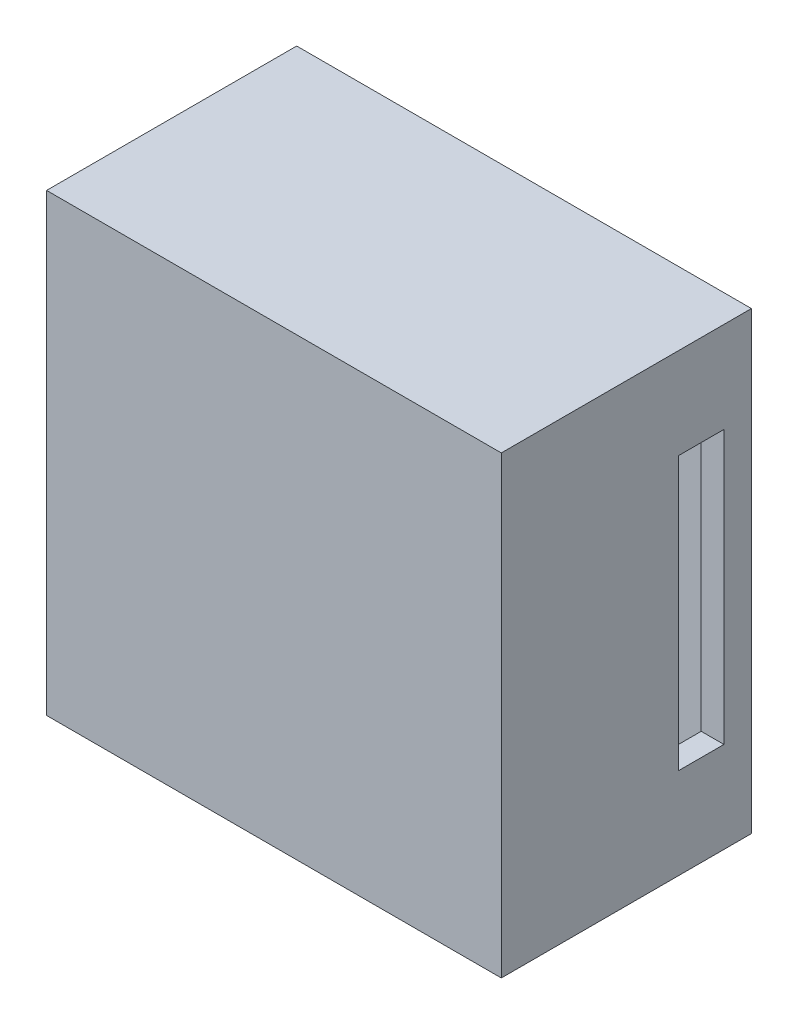
ISO-10303-21;
HEADER;
FILE_DESCRIPTION(('STEP AP214'),'2;1');
FILE_NAME('part.step','',(''),(''),'','','');
FILE_SCHEMA(('AUTOMOTIVE_DESIGN { 1 0 10303 214 1 1 1 1 }'));
ENDSEC;
DATA;
#1=APPLICATION_CONTEXT('core data for automotive mechanical design processes');
#2=APPLICATION_PROTOCOL_DEFINITION('international standard','automotive_design',2000,#1);
#3=PRODUCT_CONTEXT('',#1,'mechanical');
#4=PRODUCT('Part','Part','',(#3));
#5=PRODUCT_RELATED_PRODUCT_CATEGORY('part','',(#4));
#6=PRODUCT_DEFINITION_FORMATION('','',#4);
#7=PRODUCT_DEFINITION_CONTEXT('part definition',#1,'design');
#8=PRODUCT_DEFINITION('design','',#6,#7);
#9=PRODUCT_DEFINITION_SHAPE('','',#8);
#10=(LENGTH_UNIT() NAMED_UNIT(*) SI_UNIT(.MILLI.,.METRE.));
#11=(NAMED_UNIT(*) PLANE_ANGLE_UNIT() SI_UNIT($,.RADIAN.));
#12=(NAMED_UNIT(*) SI_UNIT($,.STERADIAN.) SOLID_ANGLE_UNIT());
#13=UNCERTAINTY_MEASURE_WITH_UNIT(LENGTH_MEASURE(1.E-05),#10,'distance_accuracy_value','');
#14=(GEOMETRIC_REPRESENTATION_CONTEXT(3) GLOBAL_UNCERTAINTY_ASSIGNED_CONTEXT((#13)) GLOBAL_UNIT_ASSIGNED_CONTEXT((#10,
#11,#12)) REPRESENTATION_CONTEXT('',''));
#15=CARTESIAN_POINT('',(0.,0.,0.));
#16=DIRECTION('',(0.,0.,1.));
#17=DIRECTION('',(1.,0.,0.));
#18=AXIS2_PLACEMENT_3D('',#15,#16,#17);
#19=CARTESIAN_POINT('',(50.,-50.,50.));
#20=DIRECTION('',(-1.,0.,0.));
#21=DIRECTION('',(0.,0.,1.));
#22=AXIS2_PLACEMENT_3D('',#19,#20,#21);
#23=PLANE('',#22);
#24=DIRECTION('',(0.,0.,-1.));
#25=VECTOR('',#24,1.);
#26=CARTESIAN_POINT('',(50.,-30.,16.0409771403343));
#27=LINE('',#26,#25);
#28=CARTESIAN_POINT('',(50.,-30.,16.0409771403343));
#29=VERTEX_POINT('',#28);
#30=CARTESIAN_POINT('',(50.,-30.,6.0409771403343));
#31=VERTEX_POINT('',#30);
#32=EDGE_CURVE('E156',#29,#31,#27,.T.);
#33=ORIENTED_EDGE('',*,*,#32,.F.);
#34=DIRECTION('',(0.,-1.,0.));
#35=VECTOR('',#34,1.);
#36=CARTESIAN_POINT('',(50.,30.,16.0409771403343));
#37=LINE('',#36,#35);
#38=CARTESIAN_POINT('',(50.,30.,16.0409771403343));
#39=VERTEX_POINT('',#38);
#40=EDGE_CURVE('E51',#39,#29,#37,.T.);
#41=ORIENTED_EDGE('',*,*,#40,.F.);
#42=DIRECTION('',(0.,0.,1.));
#43=VECTOR('',#42,1.);
#44=CARTESIAN_POINT('',(50.,30.,16.0409771403343));
#45=LINE('',#44,#43);
#46=CARTESIAN_POINT('',(50.,30.,6.04097714033431));
#47=VERTEX_POINT('',#46);
#48=EDGE_CURVE('E161',#47,#39,#45,.T.);
#49=ORIENTED_EDGE('',*,*,#48,.F.);
#50=DIRECTION('',(0.,1.,0.));
#51=VECTOR('',#50,1.);
#52=CARTESIAN_POINT('',(50.,30.,6.04097714033431));
#53=LINE('',#52,#51);
#54=EDGE_CURVE('E158',#31,#47,#53,.T.);
#55=ORIENTED_EDGE('',*,*,#54,.F.);
#56=EDGE_LOOP('',(#33,#41,#49,#55));
#57=FACE_BOUND('',#56,.T.);
#58=DIRECTION('',(0.,1.,0.));
#59=VECTOR('',#58,1.);
#60=CARTESIAN_POINT('',(50.,-50.,0.));
#61=LINE('',#60,#59);
#62=CARTESIAN_POINT('',(50.,-50.,0.));
#63=VERTEX_POINT('',#62);
#64=CARTESIAN_POINT('',(50.,50.,0.));
#65=VERTEX_POINT('',#64);
#66=EDGE_CURVE('E178',#63,#65,#61,.T.);
#67=ORIENTED_EDGE('',*,*,#66,.T.);
#68=DIRECTION('',(0.,0.,-1.));
#69=VECTOR('',#68,1.);
#70=CARTESIAN_POINT('',(50.,50.,50.));
#71=LINE('',#70,#69);
#72=CARTESIAN_POINT('',(50.,50.,55.));
#73=VERTEX_POINT('',#72);
#74=EDGE_CURVE('E214',#73,#65,#71,.T.);
#75=ORIENTED_EDGE('',*,*,#74,.F.);
#76=DIRECTION('',(0.,1.,0.));
#77=VECTOR('',#76,1.);
#78=CARTESIAN_POINT('',(50.,50.,55.));
#79=LINE('',#78,#77);
#80=CARTESIAN_POINT('',(50.,-50.,55.));
#81=VERTEX_POINT('',#80);
#82=EDGE_CURVE('E145',#81,#73,#79,.T.);
#83=ORIENTED_EDGE('',*,*,#82,.F.);
#84=DIRECTION('',(0.,0.,-1.));
#85=VECTOR('',#84,1.);
#86=CARTESIAN_POINT('',(50.,-50.,50.));
#87=LINE('',#86,#85);
#88=EDGE_CURVE('E136',#81,#63,#87,.T.);
#89=ORIENTED_EDGE('',*,*,#88,.T.);
#90=EDGE_LOOP('',(#67,#75,#83,#89));
#91=FACE_BOUND('',#90,.T.);
#92=ADVANCED_FACE('F37',(#57,#91),#23,.F.);
#93=CARTESIAN_POINT('',(-50.,50.,50.));
#94=DIRECTION('',(0.,-1.,0.));
#95=DIRECTION('',(0.,0.,-1.));
#96=AXIS2_PLACEMENT_3D('',#93,#94,#95);
#97=PLANE('',#96);
#98=DIRECTION('',(-1.,0.,0.));
#99=VECTOR('',#98,1.);
#100=CARTESIAN_POINT('',(-50.,50.,0.));
#101=LINE('',#100,#99);
#102=CARTESIAN_POINT('',(-50.,50.,0.));
#103=VERTEX_POINT('',#102);
#104=EDGE_CURVE('E207',#65,#103,#101,.T.);
#105=ORIENTED_EDGE('',*,*,#104,.T.);
#106=DIRECTION('',(0.,0.,-1.));
#107=VECTOR('',#106,1.);
#108=CARTESIAN_POINT('',(-50.,50.,50.));
#109=LINE('',#108,#107);
#110=CARTESIAN_POINT('',(-50.,50.,55.));
#111=VERTEX_POINT('',#110);
#112=EDGE_CURVE('E135',#111,#103,#109,.T.);
#113=ORIENTED_EDGE('',*,*,#112,.F.);
#114=DIRECTION('',(-1.,0.,0.));
#115=VECTOR('',#114,1.);
#116=CARTESIAN_POINT('',(-50.,50.,55.));
#117=LINE('',#116,#115);
#118=EDGE_CURVE('E150',#73,#111,#117,.T.);
#119=ORIENTED_EDGE('',*,*,#118,.F.);
#120=ORIENTED_EDGE('',*,*,#74,.T.);
#121=EDGE_LOOP('',(#105,#113,#119,#120));
#122=FACE_BOUND('',#121,.T.);
#123=ADVANCED_FACE('F241',(#122),#97,.F.);
#124=CARTESIAN_POINT('',(-50.,-50.,50.));
#125=DIRECTION('',(1.,0.,0.));
#126=DIRECTION('',(0.,0.,-1.));
#127=AXIS2_PLACEMENT_3D('',#124,#125,#126);
#128=PLANE('',#127);
#129=DIRECTION('',(0.,-1.,0.));
#130=VECTOR('',#129,1.);
#131=CARTESIAN_POINT('',(-50.,-50.,0.));
#132=LINE('',#131,#130);
#133=CARTESIAN_POINT('',(-50.,-50.,0.));
#134=VERTEX_POINT('',#133);
#135=EDGE_CURVE('E132',#103,#134,#132,.T.);
#136=ORIENTED_EDGE('',*,*,#135,.T.);
#137=DIRECTION('',(0.,0.,-1.));
#138=VECTOR('',#137,1.);
#139=CARTESIAN_POINT('',(-50.,-50.,50.));
#140=LINE('',#139,#138);
#141=CARTESIAN_POINT('',(-50.,-50.,55.));
#142=VERTEX_POINT('',#141);
#143=EDGE_CURVE('E125',#142,#134,#140,.T.);
#144=ORIENTED_EDGE('',*,*,#143,.F.);
#145=DIRECTION('',(0.,-1.,0.));
#146=VECTOR('',#145,1.);
#147=CARTESIAN_POINT('',(-50.,50.,55.));
#148=LINE('',#147,#146);
#149=EDGE_CURVE('E130',#111,#142,#148,.T.);
#150=ORIENTED_EDGE('',*,*,#149,.F.);
#151=ORIENTED_EDGE('',*,*,#112,.T.);
#152=EDGE_LOOP('',(#136,#144,#150,#151));
#153=FACE_BOUND('',#152,.T.);
#154=ADVANCED_FACE('F127',(#153),#128,.F.);
#155=CARTESIAN_POINT('',(-50.,-50.,50.));
#156=DIRECTION('',(0.,1.,0.));
#157=DIRECTION('',(0.,0.,1.));
#158=AXIS2_PLACEMENT_3D('',#155,#156,#157);
#159=PLANE('',#158);
#160=DIRECTION('',(1.,0.,0.));
#161=VECTOR('',#160,1.);
#162=CARTESIAN_POINT('',(-50.,-50.,0.));
#163=LINE('',#162,#161);
#164=EDGE_CURVE('E210',#134,#63,#163,.T.);
#165=ORIENTED_EDGE('',*,*,#164,.T.);
#166=ORIENTED_EDGE('',*,*,#88,.F.);
#167=DIRECTION('',(1.,0.,0.));
#168=VECTOR('',#167,1.);
#169=CARTESIAN_POINT('',(-50.,-50.,55.));
#170=LINE('',#169,#168);
#171=EDGE_CURVE('E139',#142,#81,#170,.T.);
#172=ORIENTED_EDGE('',*,*,#171,.F.);
#173=ORIENTED_EDGE('',*,*,#143,.T.);
#174=EDGE_LOOP('',(#165,#166,#172,#173));
#175=FACE_BOUND('',#174,.T.);
#176=ADVANCED_FACE('F140',(#175),#159,.F.);
#177=CARTESIAN_POINT('',(0.,0.,0.));
#178=DIRECTION('',(0.,0.,-1.));
#179=DIRECTION('',(-1.,0.,0.));
#180=AXIS2_PLACEMENT_3D('',#177,#178,#179);
#181=PLANE('',#180);
#182=ORIENTED_EDGE('',*,*,#66,.F.);
#183=ORIENTED_EDGE('',*,*,#164,.F.);
#184=ORIENTED_EDGE('',*,*,#135,.F.);
#185=ORIENTED_EDGE('',*,*,#104,.F.);
#186=EDGE_LOOP('',(#182,#183,#184,#185));
#187=FACE_BOUND('',#186,.T.);
#188=ADVANCED_FACE('F244',(#187),#181,.T.);
#189=CARTESIAN_POINT('',(45.,-50.,50.));
#190=DIRECTION('',(-1.,0.,0.));
#191=DIRECTION('',(0.,0.,1.));
#192=AXIS2_PLACEMENT_3D('',#189,#190,#191);
#193=PLANE('',#192);
#194=DIRECTION('',(0.,1.,0.));
#195=VECTOR('',#194,1.);
#196=CARTESIAN_POINT('',(45.,-50.,16.0409771403343));
#197=LINE('',#196,#195);
#198=CARTESIAN_POINT('',(45.,-30.,16.0409771403343));
#199=VERTEX_POINT('',#198);
#200=CARTESIAN_POINT('',(45.,30.,16.0409771403343));
#201=VERTEX_POINT('',#200);
#202=EDGE_CURVE('E11',#199,#201,#197,.T.);
#203=ORIENTED_EDGE('',*,*,#202,.F.);
#204=DIRECTION('',(0.,0.,1.));
#205=VECTOR('',#204,1.);
#206=CARTESIAN_POINT('',(45.,-30.,50.));
#207=LINE('',#206,#205);
#208=CARTESIAN_POINT('',(45.,-30.,6.0409771403343));
#209=VERTEX_POINT('',#208);
#210=EDGE_CURVE('E217',#209,#199,#207,.T.);
#211=ORIENTED_EDGE('',*,*,#210,.F.);
#212=DIRECTION('',(0.,-1.,0.));
#213=VECTOR('',#212,1.);
#214=CARTESIAN_POINT('',(45.,-50.,6.04097714033429));
#215=LINE('',#214,#213);
#216=CARTESIAN_POINT('',(45.,30.,6.04097714033431));
#217=VERTEX_POINT('',#216);
#218=EDGE_CURVE('E219',#217,#209,#215,.T.);
#219=ORIENTED_EDGE('',*,*,#218,.F.);
#220=DIRECTION('',(0.,0.,-1.));
#221=VECTOR('',#220,1.);
#222=CARTESIAN_POINT('',(45.,30.,50.));
#223=LINE('',#222,#221);
#224=EDGE_CURVE('E44',#201,#217,#223,.T.);
#225=ORIENTED_EDGE('',*,*,#224,.F.);
#226=EDGE_LOOP('',(#203,#211,#219,#225));
#227=FACE_BOUND('',#226,.T.);
#228=DIRECTION('',(0.,1.,0.));
#229=VECTOR('',#228,1.);
#230=CARTESIAN_POINT('',(45.,0.,5.));
#231=LINE('',#230,#229);
#232=CARTESIAN_POINT('',(45.,-45.,5.));
#233=VERTEX_POINT('',#232);
#234=CARTESIAN_POINT('',(45.,45.,5.));
#235=VERTEX_POINT('',#234);
#236=EDGE_CURVE('E167',#233,#235,#231,.T.);
#237=ORIENTED_EDGE('',*,*,#236,.F.);
#238=DIRECTION('',(0.,0.,-1.));
#239=VECTOR('',#238,1.);
#240=CARTESIAN_POINT('',(45.,-45.,50.));
#241=LINE('',#240,#239);
#242=CARTESIAN_POINT('',(45.,-45.,50.));
#243=VERTEX_POINT('',#242);
#244=EDGE_CURVE('E180',#243,#233,#241,.T.);
#245=ORIENTED_EDGE('',*,*,#244,.F.);
#246=DIRECTION('',(0.,1.,0.));
#247=VECTOR('',#246,1.);
#248=CARTESIAN_POINT('',(45.,0.,50.));
#249=LINE('',#248,#247);
#250=CARTESIAN_POINT('',(45.,45.,50.));
#251=VERTEX_POINT('',#250);
#252=EDGE_CURVE('E194',#243,#251,#249,.T.);
#253=ORIENTED_EDGE('',*,*,#252,.T.);
#254=DIRECTION('',(0.,0.,-1.));
#255=VECTOR('',#254,1.);
#256=CARTESIAN_POINT('',(45.,45.,50.));
#257=LINE('',#256,#255);
#258=EDGE_CURVE('E175',#251,#235,#257,.T.);
#259=ORIENTED_EDGE('',*,*,#258,.T.);
#260=EDGE_LOOP('',(#237,#245,#253,#259));
#261=FACE_BOUND('',#260,.T.);
#262=ADVANCED_FACE('F233',(#227,#261),#193,.T.);
#263=CARTESIAN_POINT('',(-50.,45.,50.));
#264=DIRECTION('',(0.,-1.,0.));
#265=DIRECTION('',(0.,0.,-1.));
#266=AXIS2_PLACEMENT_3D('',#263,#264,#265);
#267=PLANE('',#266);
#268=DIRECTION('',(-1.,0.,0.));
#269=VECTOR('',#268,1.);
#270=CARTESIAN_POINT('',(0.,45.,5.));
#271=LINE('',#270,#269);
#272=CARTESIAN_POINT('',(-45.,45.,5.));
#273=VERTEX_POINT('',#272);
#274=EDGE_CURVE('E174',#235,#273,#271,.T.);
#275=ORIENTED_EDGE('',*,*,#274,.F.);
#276=ORIENTED_EDGE('',*,*,#258,.F.);
#277=DIRECTION('',(-1.,0.,0.));
#278=VECTOR('',#277,1.);
#279=CARTESIAN_POINT('',(0.,45.,50.));
#280=LINE('',#279,#278);
#281=CARTESIAN_POINT('',(-45.,45.,50.));
#282=VERTEX_POINT('',#281);
#283=EDGE_CURVE('E197',#251,#282,#280,.T.);
#284=ORIENTED_EDGE('',*,*,#283,.T.);
#285=DIRECTION('',(0.,0.,-1.));
#286=VECTOR('',#285,1.);
#287=CARTESIAN_POINT('',(-45.,45.,50.));
#288=LINE('',#287,#286);
#289=EDGE_CURVE('E179',#282,#273,#288,.T.);
#290=ORIENTED_EDGE('',*,*,#289,.T.);
#291=EDGE_LOOP('',(#275,#276,#284,#290));
#292=FACE_BOUND('',#291,.T.);
#293=ADVANCED_FACE('F267',(#292),#267,.T.);
#294=CARTESIAN_POINT('',(-45.,-50.,50.));
#295=DIRECTION('',(1.,0.,0.));
#296=DIRECTION('',(0.,0.,-1.));
#297=AXIS2_PLACEMENT_3D('',#294,#295,#296);
#298=PLANE('',#297);
#299=DIRECTION('',(0.,-1.,0.));
#300=VECTOR('',#299,1.);
#301=CARTESIAN_POINT('',(-45.,0.,5.));
#302=LINE('',#301,#300);
#303=CARTESIAN_POINT('',(-45.,-45.,5.));
#304=VERTEX_POINT('',#303);
#305=EDGE_CURVE('E186',#273,#304,#302,.T.);
#306=ORIENTED_EDGE('',*,*,#305,.F.);
#307=ORIENTED_EDGE('',*,*,#289,.F.);
#308=DIRECTION('',(0.,-1.,0.));
#309=VECTOR('',#308,1.);
#310=CARTESIAN_POINT('',(-45.,0.,50.));
#311=LINE('',#310,#309);
#312=CARTESIAN_POINT('',(-45.,-45.,50.));
#313=VERTEX_POINT('',#312);
#314=EDGE_CURVE('E200',#282,#313,#311,.T.);
#315=ORIENTED_EDGE('',*,*,#314,.T.);
#316=DIRECTION('',(0.,0.,-1.));
#317=VECTOR('',#316,1.);
#318=CARTESIAN_POINT('',(-45.,-45.,50.));
#319=LINE('',#318,#317);
#320=EDGE_CURVE('E183',#313,#304,#319,.T.);
#321=ORIENTED_EDGE('',*,*,#320,.T.);
#322=EDGE_LOOP('',(#306,#307,#315,#321));
#323=FACE_BOUND('',#322,.T.);
#324=ADVANCED_FACE('F263',(#323),#298,.T.);
#325=CARTESIAN_POINT('',(-50.,-45.,50.));
#326=DIRECTION('',(0.,1.,0.));
#327=DIRECTION('',(0.,0.,1.));
#328=AXIS2_PLACEMENT_3D('',#325,#326,#327);
#329=PLANE('',#328);
#330=DIRECTION('',(1.,0.,0.));
#331=VECTOR('',#330,1.);
#332=CARTESIAN_POINT('',(0.,-45.,5.));
#333=LINE('',#332,#331);
#334=EDGE_CURVE('E190',#304,#233,#333,.T.);
#335=ORIENTED_EDGE('',*,*,#334,.F.);
#336=ORIENTED_EDGE('',*,*,#320,.F.);
#337=DIRECTION('',(1.,0.,0.));
#338=VECTOR('',#337,1.);
#339=CARTESIAN_POINT('',(0.,-45.,50.));
#340=LINE('',#339,#338);
#341=EDGE_CURVE('E184',#313,#243,#340,.T.);
#342=ORIENTED_EDGE('',*,*,#341,.T.);
#343=ORIENTED_EDGE('',*,*,#244,.T.);
#344=EDGE_LOOP('',(#335,#336,#342,#343));
#345=FACE_BOUND('',#344,.T.);
#346=ADVANCED_FACE('F259',(#345),#329,.T.);
#347=CARTESIAN_POINT('',(0.,0.,5.));
#348=DIRECTION('',(0.,0.,-1.));
#349=DIRECTION('',(-1.,0.,0.));
#350=AXIS2_PLACEMENT_3D('',#347,#348,#349);
#351=PLANE('',#350);
#352=ORIENTED_EDGE('',*,*,#236,.T.);
#353=ORIENTED_EDGE('',*,*,#274,.T.);
#354=ORIENTED_EDGE('',*,*,#305,.T.);
#355=ORIENTED_EDGE('',*,*,#334,.T.);
#356=EDGE_LOOP('',(#352,#353,#354,#355));
#357=FACE_BOUND('',#356,.T.);
#358=ADVANCED_FACE('F256',(#357),#351,.F.);
#359=CARTESIAN_POINT('',(31.,30.,16.0409771403343));
#360=DIRECTION('',(0.,0.,1.));
#361=DIRECTION('',(0.,-1.,0.));
#362=AXIS2_PLACEMENT_3D('',#359,#360,#361);
#363=PLANE('',#362);
#364=ORIENTED_EDGE('',*,*,#202,.T.);
#365=DIRECTION('',(1.,0.,0.));
#366=VECTOR('',#365,1.);
#367=CARTESIAN_POINT('',(31.,30.,16.0409771403343));
#368=LINE('',#367,#366);
#369=EDGE_CURVE('E165',#201,#39,#368,.T.);
#370=ORIENTED_EDGE('',*,*,#369,.T.);
#371=ORIENTED_EDGE('',*,*,#40,.T.);
#372=DIRECTION('',(1.,0.,0.));
#373=VECTOR('',#372,1.);
#374=CARTESIAN_POINT('',(31.,-30.,16.0409771403343));
#375=LINE('',#374,#373);
#376=EDGE_CURVE('E164',#199,#29,#375,.T.);
#377=ORIENTED_EDGE('',*,*,#376,.F.);
#378=EDGE_LOOP('',(#364,#370,#371,#377));
#379=FACE_BOUND('',#378,.T.);
#380=ADVANCED_FACE('F237',(#379),#363,.F.);
#381=CARTESIAN_POINT('',(31.,30.,16.0409771403343));
#382=DIRECTION('',(0.,1.,0.));
#383=DIRECTION('',(0.,0.,1.));
#384=AXIS2_PLACEMENT_3D('',#381,#382,#383);
#385=PLANE('',#384);
#386=ORIENTED_EDGE('',*,*,#224,.T.);
#387=DIRECTION('',(1.,0.,0.));
#388=VECTOR('',#387,1.);
#389=CARTESIAN_POINT('',(31.,30.,6.04097714033431));
#390=LINE('',#389,#388);
#391=EDGE_CURVE('E168',#217,#47,#390,.T.);
#392=ORIENTED_EDGE('',*,*,#391,.T.);
#393=ORIENTED_EDGE('',*,*,#48,.T.);
#394=ORIENTED_EDGE('',*,*,#369,.F.);
#395=EDGE_LOOP('',(#386,#392,#393,#394));
#396=FACE_BOUND('',#395,.T.);
#397=ADVANCED_FACE('F224',(#396),#385,.F.);
#398=CARTESIAN_POINT('',(31.,30.,6.04097714033431));
#399=DIRECTION('',(0.,0.,-1.));
#400=DIRECTION('',(0.,1.,0.));
#401=AXIS2_PLACEMENT_3D('',#398,#399,#400);
#402=PLANE('',#401);
#403=ORIENTED_EDGE('',*,*,#218,.T.);
#404=DIRECTION('',(1.,0.,0.));
#405=VECTOR('',#404,1.);
#406=CARTESIAN_POINT('',(31.,-30.,6.0409771403343));
#407=LINE('',#406,#405);
#408=EDGE_CURVE('E59',#209,#31,#407,.T.);
#409=ORIENTED_EDGE('',*,*,#408,.T.);
#410=ORIENTED_EDGE('',*,*,#54,.T.);
#411=ORIENTED_EDGE('',*,*,#391,.F.);
#412=EDGE_LOOP('',(#403,#409,#410,#411));
#413=FACE_BOUND('',#412,.T.);
#414=ADVANCED_FACE('F229',(#413),#402,.F.);
#415=CARTESIAN_POINT('',(31.,-30.,16.0409771403343));
#416=DIRECTION('',(0.,-1.,0.));
#417=DIRECTION('',(0.,0.,-1.));
#418=AXIS2_PLACEMENT_3D('',#415,#416,#417);
#419=PLANE('',#418);
#420=ORIENTED_EDGE('',*,*,#210,.T.);
#421=ORIENTED_EDGE('',*,*,#376,.T.);
#422=ORIENTED_EDGE('',*,*,#32,.T.);
#423=ORIENTED_EDGE('',*,*,#408,.F.);
#424=EDGE_LOOP('',(#420,#421,#422,#423));
#425=FACE_BOUND('',#424,.T.);
#426=ADVANCED_FACE('F235',(#425),#419,.F.);
#427=CARTESIAN_POINT('',(0.,0.,50.));
#428=DIRECTION('',(0.,0.,1.));
#429=DIRECTION('',(1.,0.,0.));
#430=AXIS2_PLACEMENT_3D('',#427,#428,#429);
#431=PLANE('',#430);
#432=ORIENTED_EDGE('',*,*,#252,.F.);
#433=ORIENTED_EDGE('',*,*,#341,.F.);
#434=ORIENTED_EDGE('',*,*,#314,.F.);
#435=ORIENTED_EDGE('',*,*,#283,.F.);
#436=EDGE_LOOP('',(#432,#433,#434,#435));
#437=FACE_BOUND('',#436,.T.);
#438=ADVANCED_FACE('F278',(#437),#431,.F.);
#439=CARTESIAN_POINT('',(0.,0.,55.));
#440=DIRECTION('',(0.,0.,1.));
#441=DIRECTION('',(1.,0.,0.));
#442=AXIS2_PLACEMENT_3D('',#439,#440,#441);
#443=PLANE('',#442);
#444=ORIENTED_EDGE('',*,*,#149,.T.);
#445=ORIENTED_EDGE('',*,*,#171,.T.);
#446=ORIENTED_EDGE('',*,*,#82,.T.);
#447=ORIENTED_EDGE('',*,*,#118,.T.);
#448=EDGE_LOOP('',(#444,#445,#446,#447));
#449=FACE_BOUND('',#448,.T.);
#450=ADVANCED_FACE('F148',(#449),#443,.T.);
#451=CLOSED_SHELL('',(#92,#123,#154,#176,#188,#262,#293,#324,#346,#358,#380,#397,#414,#426,#438,#450));
#452=MANIFOLD_SOLID_BREP('B2',#451);
#453=ADVANCED_BREP_SHAPE_REPRESENTATION('',(#18,#452),#14);
#454=SHAPE_DEFINITION_REPRESENTATION(#9,#453);
ENDSEC;
END-ISO-10303-21;
